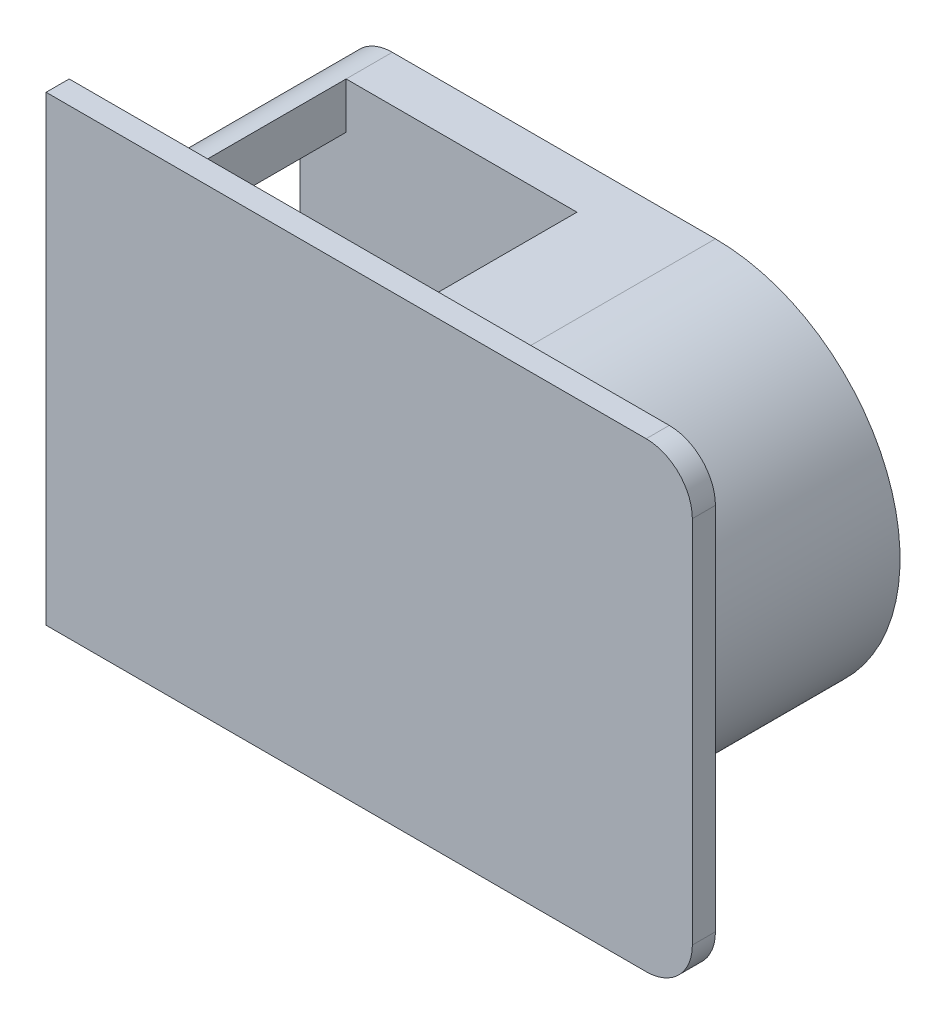
ISO-10303-21;
HEADER;
FILE_DESCRIPTION(('STEP AP214'),'2;1');
FILE_NAME('part.step','',(''),(''),'','','');
FILE_SCHEMA(('AUTOMOTIVE_DESIGN { 1 0 10303 214 1 1 1 1 }'));
ENDSEC;
DATA;
#1=APPLICATION_CONTEXT('core data for automotive mechanical design processes');
#2=APPLICATION_PROTOCOL_DEFINITION('international standard','automotive_design',2000,#1);
#3=PRODUCT_CONTEXT('',#1,'mechanical');
#4=PRODUCT('Part','Part','',(#3));
#5=PRODUCT_RELATED_PRODUCT_CATEGORY('part','',(#4));
#6=PRODUCT_DEFINITION_FORMATION('','',#4);
#7=PRODUCT_DEFINITION_CONTEXT('part definition',#1,'design');
#8=PRODUCT_DEFINITION('design','',#6,#7);
#9=PRODUCT_DEFINITION_SHAPE('','',#8);
#10=(LENGTH_UNIT() NAMED_UNIT(*) SI_UNIT(.MILLI.,.METRE.));
#11=(NAMED_UNIT(*) PLANE_ANGLE_UNIT() SI_UNIT($,.RADIAN.));
#12=(NAMED_UNIT(*) SI_UNIT($,.STERADIAN.) SOLID_ANGLE_UNIT());
#13=UNCERTAINTY_MEASURE_WITH_UNIT(LENGTH_MEASURE(1.E-05),#10,'distance_accuracy_value','');
#14=(GEOMETRIC_REPRESENTATION_CONTEXT(3) GLOBAL_UNCERTAINTY_ASSIGNED_CONTEXT((#13)) GLOBAL_UNIT_ASSIGNED_CONTEXT((#10,
#11,#12)) REPRESENTATION_CONTEXT('',''));
#15=CARTESIAN_POINT('',(0.,0.,0.));
#16=DIRECTION('',(0.,0.,1.));
#17=DIRECTION('',(1.,0.,0.));
#18=AXIS2_PLACEMENT_3D('',#15,#16,#17);
#19=CARTESIAN_POINT('',(-50.,-40.,50.));
#20=DIRECTION('',(-1.,0.,0.));
#21=DIRECTION('',(0.,0.,1.));
#22=AXIS2_PLACEMENT_3D('',#19,#20,#21);
#23=PLANE('',#22);
#24=DIRECTION('',(0.,1.,0.));
#25=VECTOR('',#24,1.);
#26=CARTESIAN_POINT('',(-50.,-40.,10.));
#27=LINE('',#26,#25);
#28=CARTESIAN_POINT('',(-50.,-40.,10.));
#29=VERTEX_POINT('',#28);
#30=CARTESIAN_POINT('',(-50.,-30.,10.));
#31=VERTEX_POINT('',#30);
#32=EDGE_CURVE('E254',#29,#31,#27,.T.);
#33=ORIENTED_EDGE('',*,*,#32,.T.);
#34=DIRECTION('',(0.,0.,1.));
#35=VECTOR('',#34,1.);
#36=CARTESIAN_POINT('',(-50.,-30.,50.));
#37=LINE('',#36,#35);
#38=CARTESIAN_POINT('',(-50.,-30.,50.));
#39=VERTEX_POINT('',#38);
#40=EDGE_CURVE('E218',#31,#39,#37,.T.);
#41=ORIENTED_EDGE('',*,*,#40,.T.);
#42=DIRECTION('',(0.,1.,0.));
#43=VECTOR('',#42,1.);
#44=CARTESIAN_POINT('',(-50.,-40.,50.));
#45=LINE('',#44,#43);
#46=CARTESIAN_POINT('',(-50.,-40.,50.));
#47=VERTEX_POINT('',#46);
#48=EDGE_CURVE('E250',#47,#39,#45,.T.);
#49=ORIENTED_EDGE('',*,*,#48,.F.);
#50=DIRECTION('',(0.,0.,1.));
#51=VECTOR('',#50,1.);
#52=CARTESIAN_POINT('',(-50.,-40.,50.));
#53=LINE('',#52,#51);
#54=EDGE_CURVE('E232',#29,#47,#53,.T.);
#55=ORIENTED_EDGE('',*,*,#54,.F.);
#56=EDGE_LOOP('',(#33,#41,#49,#55));
#57=FACE_BOUND('',#56,.T.);
#58=ADVANCED_FACE('F44',(#57),#23,.F.);
#59=CARTESIAN_POINT('',(0.,-40.,50.));
#60=DIRECTION('',(0.,1.,0.));
#61=DIRECTION('',(0.,0.,1.));
#62=AXIS2_PLACEMENT_3D('',#59,#60,#61);
#63=PLANE('',#62);
#64=DIRECTION('',(-1.,0.,0.));
#65=VECTOR('',#64,1.);
#66=CARTESIAN_POINT('',(-50.,-40.,10.));
#67=LINE('',#66,#65);
#68=CARTESIAN_POINT('',(0.,-40.,10.));
#69=VERTEX_POINT('',#68);
#70=EDGE_CURVE('E227',#69,#29,#67,.T.);
#71=ORIENTED_EDGE('',*,*,#70,.T.);
#72=DIRECTION('',(0.,0.,-1.));
#73=VECTOR('',#72,1.);
#74=CARTESIAN_POINT('',(-50.,-40.,0.));
#75=LINE('',#74,#73);
#76=CARTESIAN_POINT('',(-50.,-40.,0.));
#77=VERTEX_POINT('',#76);
#78=EDGE_CURVE('E361',#29,#77,#75,.T.);
#79=ORIENTED_EDGE('',*,*,#78,.T.);
#80=DIRECTION('',(1.,0.,0.));
#81=VECTOR('',#80,1.);
#82=CARTESIAN_POINT('',(0.,-40.,0.));
#83=LINE('',#82,#81);
#84=CARTESIAN_POINT('',(20.,-40.,0.));
#85=VERTEX_POINT('',#84);
#86=EDGE_CURVE('E304',#77,#85,#83,.T.);
#87=ORIENTED_EDGE('',*,*,#86,.T.);
#88=DIRECTION('',(0.,0.,-1.));
#89=VECTOR('',#88,1.);
#90=CARTESIAN_POINT('',(20.,-40.,50.));
#91=LINE('',#90,#89);
#92=CARTESIAN_POINT('',(20.,-40.,50.));
#93=VERTEX_POINT('',#92);
#94=EDGE_CURVE('E331',#93,#85,#91,.T.);
#95=ORIENTED_EDGE('',*,*,#94,.F.);
#96=DIRECTION('',(1.,0.,0.));
#97=VECTOR('',#96,1.);
#98=CARTESIAN_POINT('',(0.,-40.,50.));
#99=LINE('',#98,#97);
#100=CARTESIAN_POINT('',(0.,-40.,50.));
#101=VERTEX_POINT('',#100);
#102=EDGE_CURVE('E305',#101,#93,#99,.T.);
#103=ORIENTED_EDGE('',*,*,#102,.F.);
#104=DIRECTION('',(0.,0.,-1.));
#105=VECTOR('',#104,1.);
#106=CARTESIAN_POINT('',(0.,-40.,50.));
#107=LINE('',#106,#105);
#108=EDGE_CURVE('E223',#101,#69,#107,.T.);
#109=ORIENTED_EDGE('',*,*,#108,.T.);
#110=EDGE_LOOP('',(#71,#79,#87,#95,#103,#109));
#111=FACE_BOUND('',#110,.T.);
#112=ADVANCED_FACE('F419',(#111),#63,.F.);
#113=CARTESIAN_POINT('',(20.,0.,50.));
#114=DIRECTION('',(0.,0.,-1.));
#115=DIRECTION('',(-1.,0.,0.));
#116=AXIS2_PLACEMENT_3D('',#113,#114,#115);
#117=CYLINDRICAL_SURFACE('',#116,40.);
#118=CARTESIAN_POINT('',(20.,0.,0.));
#119=DIRECTION('',(0.,0.,1.));
#120=DIRECTION('',(1.,0.,0.));
#121=AXIS2_PLACEMENT_3D('',#118,#119,#120);
#122=CIRCLE('',#121,40.);
#123=CARTESIAN_POINT('',(20.,40.,0.));
#124=VERTEX_POINT('',#123);
#125=EDGE_CURVE('E319',#85,#124,#122,.T.);
#126=ORIENTED_EDGE('',*,*,#125,.T.);
#127=DIRECTION('',(0.,0.,-1.));
#128=VECTOR('',#127,1.);
#129=CARTESIAN_POINT('',(20.,40.,50.));
#130=LINE('',#129,#128);
#131=CARTESIAN_POINT('',(20.,40.,50.));
#132=VERTEX_POINT('',#131);
#133=EDGE_CURVE('E316',#132,#124,#130,.T.);
#134=ORIENTED_EDGE('',*,*,#133,.F.);
#135=CARTESIAN_POINT('',(20.,0.,50.));
#136=DIRECTION('',(0.,0.,1.));
#137=DIRECTION('',(1.,0.,0.));
#138=AXIS2_PLACEMENT_3D('',#135,#136,#137);
#139=CIRCLE('',#138,40.);
#140=EDGE_CURVE('E308',#93,#132,#139,.T.);
#141=ORIENTED_EDGE('',*,*,#140,.F.);
#142=ORIENTED_EDGE('',*,*,#94,.T.);
#143=EDGE_LOOP('',(#126,#134,#141,#142));
#144=FACE_BOUND('',#143,.T.);
#145=ADVANCED_FACE('F401',(#144),#117,.T.);
#146=CARTESIAN_POINT('',(0.,40.,50.));
#147=DIRECTION('',(0.,1.,0.));
#148=DIRECTION('',(0.,0.,1.));
#149=AXIS2_PLACEMENT_3D('',#146,#147,#148);
#150=PLANE('',#149);
#151=DIRECTION('',(1.,0.,0.));
#152=VECTOR('',#151,1.);
#153=CARTESIAN_POINT('',(0.,40.,0.));
#154=LINE('',#153,#152);
#155=CARTESIAN_POINT('',(-50.,40.,0.));
#156=VERTEX_POINT('',#155);
#157=EDGE_CURVE('E323',#156,#124,#154,.T.);
#158=ORIENTED_EDGE('',*,*,#157,.F.);
#159=DIRECTION('',(0.,0.,-1.));
#160=VECTOR('',#159,1.);
#161=CARTESIAN_POINT('',(-50.,40.,50.));
#162=LINE('',#161,#160);
#163=CARTESIAN_POINT('',(-50.,40.,10.));
#164=VERTEX_POINT('',#163);
#165=EDGE_CURVE('E53',#156,#164,#162,.F.);
#166=ORIENTED_EDGE('',*,*,#165,.T.);
#167=DIRECTION('',(-1.,0.,0.));
#168=VECTOR('',#167,1.);
#169=CARTESIAN_POINT('',(-50.,40.,10.));
#170=LINE('',#169,#168);
#171=CARTESIAN_POINT('',(0.,40.,10.));
#172=VERTEX_POINT('',#171);
#173=EDGE_CURVE('E240',#172,#164,#170,.T.);
#174=ORIENTED_EDGE('',*,*,#173,.F.);
#175=DIRECTION('',(0.,0.,-1.));
#176=VECTOR('',#175,1.);
#177=CARTESIAN_POINT('',(0.,40.,50.));
#178=LINE('',#177,#176);
#179=CARTESIAN_POINT('',(0.,40.,50.));
#180=VERTEX_POINT('',#179);
#181=EDGE_CURVE('E222',#180,#172,#178,.T.);
#182=ORIENTED_EDGE('',*,*,#181,.F.);
#183=DIRECTION('',(1.,0.,0.));
#184=VECTOR('',#183,1.);
#185=CARTESIAN_POINT('',(0.,40.,50.));
#186=LINE('',#185,#184);
#187=EDGE_CURVE('E313',#180,#132,#186,.T.);
#188=ORIENTED_EDGE('',*,*,#187,.T.);
#189=ORIENTED_EDGE('',*,*,#133,.T.);
#190=EDGE_LOOP('',(#158,#166,#174,#182,#188,#189));
#191=FACE_BOUND('',#190,.T.);
#192=ADVANCED_FACE('F381',(#191),#150,.T.);
#193=CARTESIAN_POINT('',(-60.,0.,50.));
#194=DIRECTION('',(-1.,0.,0.));
#195=DIRECTION('',(0.,0.,1.));
#196=AXIS2_PLACEMENT_3D('',#193,#194,#195);
#197=PLANE('',#196);
#198=DIRECTION('',(0.,-1.,0.));
#199=VECTOR('',#198,1.);
#200=CARTESIAN_POINT('',(-60.,-30.,10.));
#201=LINE('',#200,#199);
#202=CARTESIAN_POINT('',(-60.,30.,10.));
#203=VERTEX_POINT('',#202);
#204=CARTESIAN_POINT('',(-60.,-30.,10.));
#205=VERTEX_POINT('',#204);
#206=EDGE_CURVE('E192',#203,#205,#201,.T.);
#207=ORIENTED_EDGE('',*,*,#206,.F.);
#208=DIRECTION('',(0.,0.,-1.));
#209=VECTOR('',#208,1.);
#210=CARTESIAN_POINT('',(-60.,30.,50.));
#211=LINE('',#210,#209);
#212=CARTESIAN_POINT('',(-60.,30.,0.));
#213=VERTEX_POINT('',#212);
#214=EDGE_CURVE('E68',#203,#213,#211,.T.);
#215=ORIENTED_EDGE('',*,*,#214,.T.);
#216=DIRECTION('',(0.,1.,0.));
#217=VECTOR('',#216,1.);
#218=CARTESIAN_POINT('',(-60.,0.,0.));
#219=LINE('',#218,#217);
#220=CARTESIAN_POINT('',(-60.,-30.,0.));
#221=VERTEX_POINT('',#220);
#222=EDGE_CURVE('E309',#221,#213,#219,.T.);
#223=ORIENTED_EDGE('',*,*,#222,.F.);
#224=DIRECTION('',(0.,0.,-1.));
#225=VECTOR('',#224,1.);
#226=CARTESIAN_POINT('',(-60.,-30.,50.));
#227=LINE('',#226,#225);
#228=EDGE_CURVE('E367',#221,#205,#227,.F.);
#229=ORIENTED_EDGE('',*,*,#228,.T.);
#230=EDGE_LOOP('',(#207,#215,#223,#229));
#231=FACE_BOUND('',#230,.T.);
#232=ADVANCED_FACE('F412',(#231),#197,.T.);
#233=CARTESIAN_POINT('',(0.,0.,0.));
#234=DIRECTION('',(0.,0.,1.));
#235=DIRECTION('',(1.,0.,0.));
#236=AXIS2_PLACEMENT_3D('',#233,#234,#235);
#237=PLANE('',#236);
#238=CARTESIAN_POINT('',(-30.,0.,0.));
#239=DIRECTION('',(0.,0.,-1.));
#240=DIRECTION('',(-1.,0.,0.));
#241=AXIS2_PLACEMENT_3D('',#238,#239,#240);
#242=CIRCLE('',#241,2.5);
#243=CARTESIAN_POINT('',(-32.5,0.,0.));
#244=VERTEX_POINT('',#243);
#245=EDGE_CURVE('E200',#244,#244,#242,.T.);
#246=ORIENTED_EDGE('',*,*,#245,.F.);
#247=EDGE_LOOP('',(#246));
#248=FACE_BOUND('',#247,.T.);
#249=CARTESIAN_POINT('',(20.,0.,0.));
#250=DIRECTION('',(0.,0.,-1.));
#251=DIRECTION('',(-1.,0.,0.));
#252=AXIS2_PLACEMENT_3D('',#249,#250,#251);
#253=CIRCLE('',#252,5.);
#254=CARTESIAN_POINT('',(15.,0.,0.));
#255=VERTEX_POINT('',#254);
#256=EDGE_CURVE('E249',#255,#255,#253,.T.);
#257=ORIENTED_EDGE('',*,*,#256,.F.);
#258=EDGE_LOOP('',(#257));
#259=FACE_BOUND('',#258,.T.);
#260=ORIENTED_EDGE('',*,*,#222,.T.);
#261=CARTESIAN_POINT('',(-50.,30.,0.));
#262=DIRECTION('',(0.,0.,1.));
#263=DIRECTION('',(1.,0.,0.));
#264=AXIS2_PLACEMENT_3D('',#261,#262,#263);
#265=CIRCLE('',#264,10.);
#266=EDGE_CURVE('E60',#213,#156,#265,.F.);
#267=ORIENTED_EDGE('',*,*,#266,.T.);
#268=ORIENTED_EDGE('',*,*,#157,.T.);
#269=ORIENTED_EDGE('',*,*,#125,.F.);
#270=ORIENTED_EDGE('',*,*,#86,.F.);
#271=CARTESIAN_POINT('',(-50.,-30.,0.));
#272=DIRECTION('',(0.,0.,1.));
#273=DIRECTION('',(1.,0.,0.));
#274=AXIS2_PLACEMENT_3D('',#271,#272,#273);
#275=CIRCLE('',#274,10.);
#276=EDGE_CURVE('E364',#77,#221,#275,.F.);
#277=ORIENTED_EDGE('',*,*,#276,.T.);
#278=EDGE_LOOP('',(#260,#267,#268,#269,#270,#277));
#279=FACE_BOUND('',#278,.T.);
#280=ADVANCED_FACE('F404',(#248,#259,#279),#237,.F.);
#281=CARTESIAN_POINT('',(70.,-50.,55.));
#282=DIRECTION('',(-1.,0.,0.));
#283=DIRECTION('',(0.,0.,1.));
#284=AXIS2_PLACEMENT_3D('',#281,#282,#283);
#285=PLANE('',#284);
#286=DIRECTION('',(0.,1.,0.));
#287=VECTOR('',#286,1.);
#288=CARTESIAN_POINT('',(70.,-50.,50.));
#289=LINE('',#288,#287);
#290=CARTESIAN_POINT('',(70.,-40.,50.));
#291=VERTEX_POINT('',#290);
#292=CARTESIAN_POINT('',(70.,40.,50.));
#293=VERTEX_POINT('',#292);
#294=EDGE_CURVE('E265',#291,#293,#289,.T.);
#295=ORIENTED_EDGE('',*,*,#294,.T.);
#296=DIRECTION('',(0.,0.,-1.));
#297=VECTOR('',#296,1.);
#298=CARTESIAN_POINT('',(70.,40.,55.));
#299=LINE('',#298,#297);
#300=CARTESIAN_POINT('',(70.,40.,55.));
#301=VERTEX_POINT('',#300);
#302=EDGE_CURVE('E355',#293,#301,#299,.F.);
#303=ORIENTED_EDGE('',*,*,#302,.T.);
#304=DIRECTION('',(0.,1.,0.));
#305=VECTOR('',#304,1.);
#306=CARTESIAN_POINT('',(70.,-50.,55.));
#307=LINE('',#306,#305);
#308=CARTESIAN_POINT('',(70.,-40.,55.));
#309=VERTEX_POINT('',#308);
#310=EDGE_CURVE('E269',#309,#301,#307,.T.);
#311=ORIENTED_EDGE('',*,*,#310,.F.);
#312=DIRECTION('',(0.,0.,-1.));
#313=VECTOR('',#312,1.);
#314=CARTESIAN_POINT('',(70.,-40.,55.));
#315=LINE('',#314,#313);
#316=EDGE_CURVE('E334',#309,#291,#315,.T.);
#317=ORIENTED_EDGE('',*,*,#316,.T.);
#318=EDGE_LOOP('',(#295,#303,#311,#317));
#319=FACE_BOUND('',#318,.T.);
#320=ADVANCED_FACE('F503',(#319),#285,.F.);
#321=CARTESIAN_POINT('',(-70.,50.,55.));
#322=DIRECTION('',(0.,-1.,0.));
#323=DIRECTION('',(0.,0.,-1.));
#324=AXIS2_PLACEMENT_3D('',#321,#322,#323);
#325=PLANE('',#324);
#326=DIRECTION('',(-1.,0.,0.));
#327=VECTOR('',#326,1.);
#328=CARTESIAN_POINT('',(-70.,50.,55.));
#329=LINE('',#328,#327);
#330=CARTESIAN_POINT('',(60.,50.,55.));
#331=VERTEX_POINT('',#330);
#332=CARTESIAN_POINT('',(-70.,50.,55.));
#333=VERTEX_POINT('',#332);
#334=EDGE_CURVE('E273',#331,#333,#329,.T.);
#335=ORIENTED_EDGE('',*,*,#334,.F.);
#336=DIRECTION('',(0.,0.,-1.));
#337=VECTOR('',#336,1.);
#338=CARTESIAN_POINT('',(60.,50.,55.));
#339=LINE('',#338,#337);
#340=CARTESIAN_POINT('',(60.,50.,50.));
#341=VERTEX_POINT('',#340);
#342=EDGE_CURVE('E348',#331,#341,#339,.T.);
#343=ORIENTED_EDGE('',*,*,#342,.T.);
#344=DIRECTION('',(-1.,0.,0.));
#345=VECTOR('',#344,1.);
#346=CARTESIAN_POINT('',(-70.,50.,50.));
#347=LINE('',#346,#345);
#348=CARTESIAN_POINT('',(-70.,50.,50.));
#349=VERTEX_POINT('',#348);
#350=EDGE_CURVE('E288',#341,#349,#347,.T.);
#351=ORIENTED_EDGE('',*,*,#350,.T.);
#352=DIRECTION('',(0.,0.,-1.));
#353=VECTOR('',#352,1.);
#354=CARTESIAN_POINT('',(-70.,50.,55.));
#355=LINE('',#354,#353);
#356=EDGE_CURVE('E300',#333,#349,#355,.T.);
#357=ORIENTED_EDGE('',*,*,#356,.F.);
#358=EDGE_LOOP('',(#335,#343,#351,#357));
#359=FACE_BOUND('',#358,.T.);
#360=ADVANCED_FACE('F574',(#359),#325,.F.);
#361=CARTESIAN_POINT('',(-70.,-50.,55.));
#362=DIRECTION('',(1.,0.,0.));
#363=DIRECTION('',(0.,0.,-1.));
#364=AXIS2_PLACEMENT_3D('',#361,#362,#363);
#365=PLANE('',#364);
#366=DIRECTION('',(0.,-1.,0.));
#367=VECTOR('',#366,1.);
#368=CARTESIAN_POINT('',(-70.,-50.,50.));
#369=LINE('',#368,#367);
#370=CARTESIAN_POINT('',(-70.,-50.,50.));
#371=VERTEX_POINT('',#370);
#372=EDGE_CURVE('E291',#349,#371,#369,.T.);
#373=ORIENTED_EDGE('',*,*,#372,.T.);
#374=DIRECTION('',(0.,0.,-1.));
#375=VECTOR('',#374,1.);
#376=CARTESIAN_POINT('',(-70.,-50.,55.));
#377=LINE('',#376,#375);
#378=CARTESIAN_POINT('',(-70.,-50.,55.));
#379=VERTEX_POINT('',#378);
#380=EDGE_CURVE('E284',#379,#371,#377,.T.);
#381=ORIENTED_EDGE('',*,*,#380,.F.);
#382=DIRECTION('',(0.,-1.,0.));
#383=VECTOR('',#382,1.);
#384=CARTESIAN_POINT('',(-70.,-50.,55.));
#385=LINE('',#384,#383);
#386=EDGE_CURVE('E277',#333,#379,#385,.T.);
#387=ORIENTED_EDGE('',*,*,#386,.F.);
#388=ORIENTED_EDGE('',*,*,#356,.T.);
#389=EDGE_LOOP('',(#373,#381,#387,#388));
#390=FACE_BOUND('',#389,.T.);
#391=ADVANCED_FACE('F579',(#390),#365,.F.);
#392=CARTESIAN_POINT('',(-70.,-50.,55.));
#393=DIRECTION('',(0.,1.,0.));
#394=DIRECTION('',(0.,0.,1.));
#395=AXIS2_PLACEMENT_3D('',#392,#393,#394);
#396=PLANE('',#395);
#397=DIRECTION('',(1.,0.,0.));
#398=VECTOR('',#397,1.);
#399=CARTESIAN_POINT('',(-70.,-50.,50.));
#400=LINE('',#399,#398);
#401=CARTESIAN_POINT('',(60.,-50.,50.));
#402=VERTEX_POINT('',#401);
#403=EDGE_CURVE('E274',#371,#402,#400,.T.);
#404=ORIENTED_EDGE('',*,*,#403,.T.);
#405=DIRECTION('',(0.,0.,-1.));
#406=VECTOR('',#405,1.);
#407=CARTESIAN_POINT('',(60.,-50.,55.));
#408=LINE('',#407,#406);
#409=CARTESIAN_POINT('',(60.,-50.,55.));
#410=VERTEX_POINT('',#409);
#411=EDGE_CURVE('E342',#402,#410,#408,.F.);
#412=ORIENTED_EDGE('',*,*,#411,.T.);
#413=DIRECTION('',(1.,0.,0.));
#414=VECTOR('',#413,1.);
#415=CARTESIAN_POINT('',(-70.,-50.,55.));
#416=LINE('',#415,#414);
#417=EDGE_CURVE('E280',#379,#410,#416,.T.);
#418=ORIENTED_EDGE('',*,*,#417,.F.);
#419=ORIENTED_EDGE('',*,*,#380,.T.);
#420=EDGE_LOOP('',(#404,#412,#418,#419));
#421=FACE_BOUND('',#420,.T.);
#422=ADVANCED_FACE('F564',(#421),#396,.F.);
#423=CARTESIAN_POINT('',(0.,0.,55.));
#424=DIRECTION('',(0.,0.,-1.));
#425=DIRECTION('',(-1.,0.,0.));
#426=AXIS2_PLACEMENT_3D('',#423,#424,#425);
#427=PLANE('',#426);
#428=ORIENTED_EDGE('',*,*,#310,.T.);
#429=CARTESIAN_POINT('',(60.,40.,55.));
#430=DIRECTION('',(0.,0.,-1.));
#431=DIRECTION('',(-1.,0.,0.));
#432=AXIS2_PLACEMENT_3D('',#429,#430,#431);
#433=CIRCLE('',#432,10.);
#434=EDGE_CURVE('E358',#301,#331,#433,.F.);
#435=ORIENTED_EDGE('',*,*,#434,.T.);
#436=ORIENTED_EDGE('',*,*,#334,.T.);
#437=ORIENTED_EDGE('',*,*,#386,.T.);
#438=ORIENTED_EDGE('',*,*,#417,.T.);
#439=CARTESIAN_POINT('',(60.,-40.,55.));
#440=DIRECTION('',(0.,0.,-1.));
#441=DIRECTION('',(-1.,0.,0.));
#442=AXIS2_PLACEMENT_3D('',#439,#440,#441);
#443=CIRCLE('',#442,10.);
#444=EDGE_CURVE('E345',#410,#309,#443,.F.);
#445=ORIENTED_EDGE('',*,*,#444,.T.);
#446=EDGE_LOOP('',(#428,#435,#436,#437,#438,#445));
#447=FACE_BOUND('',#446,.T.);
#448=ADVANCED_FACE('F489',(#447),#427,.F.);
#449=CARTESIAN_POINT('',(0.,0.,50.));
#450=DIRECTION('',(0.,0.,-1.));
#451=DIRECTION('',(-1.,0.,0.));
#452=AXIS2_PLACEMENT_3D('',#449,#450,#451);
#453=PLANE('',#452);
#454=ORIENTED_EDGE('',*,*,#48,.T.);
#455=DIRECTION('',(-1.,0.,0.));
#456=VECTOR('',#455,1.);
#457=CARTESIAN_POINT('',(-10.,-30.,50.));
#458=LINE('',#457,#456);
#459=CARTESIAN_POINT('',(-60.,-30.,50.));
#460=VERTEX_POINT('',#459);
#461=EDGE_CURVE('E206',#39,#460,#458,.T.);
#462=ORIENTED_EDGE('',*,*,#461,.T.);
#463=CARTESIAN_POINT('',(-50.,-30.,50.));
#464=DIRECTION('',(0.,0.,-1.));
#465=DIRECTION('',(-1.,0.,0.));
#466=AXIS2_PLACEMENT_3D('',#463,#464,#465);
#467=CIRCLE('',#466,10.);
#468=EDGE_CURVE('E370',#460,#47,#467,.F.);
#469=ORIENTED_EDGE('',*,*,#468,.T.);
#470=EDGE_LOOP('',(#454,#462,#469));
#471=FACE_BOUND('',#470,.T.);
#472=DIRECTION('',(-1.,0.,0.));
#473=VECTOR('',#472,1.);
#474=CARTESIAN_POINT('',(-10.,30.,50.));
#475=LINE('',#474,#473);
#476=CARTESIAN_POINT('',(-50.,30.,50.));
#477=VERTEX_POINT('',#476);
#478=CARTESIAN_POINT('',(-60.,30.,50.));
#479=VERTEX_POINT('',#478);
#480=EDGE_CURVE('E173',#477,#479,#475,.T.);
#481=ORIENTED_EDGE('',*,*,#480,.F.);
#482=CARTESIAN_POINT('',(-50.,40.,50.));
#483=VERTEX_POINT('',#482);
#484=EDGE_CURVE('E175',#477,#483,#45,.T.);
#485=ORIENTED_EDGE('',*,*,#484,.T.);
#486=CARTESIAN_POINT('',(-50.,30.,50.));
#487=DIRECTION('',(0.,0.,-1.));
#488=DIRECTION('',(-1.,0.,0.));
#489=AXIS2_PLACEMENT_3D('',#486,#487,#488);
#490=CIRCLE('',#489,10.);
#491=EDGE_CURVE('E11',#483,#479,#490,.F.);
#492=ORIENTED_EDGE('',*,*,#491,.T.);
#493=EDGE_LOOP('',(#481,#485,#492));
#494=FACE_BOUND('',#493,.T.);
#495=DIRECTION('',(0.,1.,0.));
#496=VECTOR('',#495,1.);
#497=CARTESIAN_POINT('',(0.,-40.,50.));
#498=LINE('',#497,#496);
#499=EDGE_CURVE('E246',#101,#180,#498,.T.);
#500=ORIENTED_EDGE('',*,*,#499,.F.);
#501=ORIENTED_EDGE('',*,*,#102,.T.);
#502=ORIENTED_EDGE('',*,*,#140,.T.);
#503=ORIENTED_EDGE('',*,*,#187,.F.);
#504=EDGE_LOOP('',(#500,#501,#502,#503));
#505=FACE_BOUND('',#504,.T.);
#506=ORIENTED_EDGE('',*,*,#350,.F.);
#507=CARTESIAN_POINT('',(60.,40.,50.));
#508=DIRECTION('',(0.,0.,-1.));
#509=DIRECTION('',(-1.,0.,0.));
#510=AXIS2_PLACEMENT_3D('',#507,#508,#509);
#511=CIRCLE('',#510,10.);
#512=EDGE_CURVE('E352',#341,#293,#511,.T.);
#513=ORIENTED_EDGE('',*,*,#512,.T.);
#514=ORIENTED_EDGE('',*,*,#294,.F.);
#515=CARTESIAN_POINT('',(60.,-40.,50.));
#516=DIRECTION('',(0.,0.,-1.));
#517=DIRECTION('',(-1.,0.,0.));
#518=AXIS2_PLACEMENT_3D('',#515,#516,#517);
#519=CIRCLE('',#518,10.);
#520=EDGE_CURVE('E339',#291,#402,#519,.T.);
#521=ORIENTED_EDGE('',*,*,#520,.T.);
#522=ORIENTED_EDGE('',*,*,#403,.F.);
#523=ORIENTED_EDGE('',*,*,#372,.F.);
#524=EDGE_LOOP('',(#506,#513,#514,#521,#522,#523));
#525=FACE_BOUND('',#524,.T.);
#526=ADVANCED_FACE('F171',(#471,#494,#505,#525),#453,.T.);
#527=CARTESIAN_POINT('',(20.,0.,5.));
#528=DIRECTION('',(0.,0.,-1.));
#529=DIRECTION('',(-1.,0.,0.));
#530=AXIS2_PLACEMENT_3D('',#527,#528,#529);
#531=CYLINDRICAL_SURFACE('',#530,5.);
#532=CARTESIAN_POINT('',(20.,0.,5.));
#533=DIRECTION('',(0.,0.,-1.));
#534=DIRECTION('',(-1.,0.,0.));
#535=AXIS2_PLACEMENT_3D('',#532,#533,#534);
#536=CIRCLE('',#535,5.);
#537=CARTESIAN_POINT('',(15.,0.,5.));
#538=VERTEX_POINT('',#537);
#539=EDGE_CURVE('E261',#538,#538,#536,.T.);
#540=ORIENTED_EDGE('',*,*,#539,.F.);
#541=EDGE_LOOP('',(#540));
#542=FACE_BOUND('',#541,.T.);
#543=ORIENTED_EDGE('',*,*,#256,.T.);
#544=EDGE_LOOP('',(#543));
#545=FACE_BOUND('',#544,.T.);
#546=ADVANCED_FACE('F488',(#542,#545),#531,.F.);
#547=CARTESIAN_POINT('',(20.,0.,5.));
#548=DIRECTION('',(0.,0.,-1.));
#549=DIRECTION('',(-1.,0.,0.));
#550=AXIS2_PLACEMENT_3D('',#547,#548,#549);
#551=PLANE('',#550);
#552=ORIENTED_EDGE('',*,*,#539,.T.);
#553=EDGE_LOOP('',(#552));
#554=FACE_BOUND('',#553,.T.);
#555=ADVANCED_FACE('F620',(#554),#551,.T.);
#556=CARTESIAN_POINT('',(0.,-40.,50.));
#557=DIRECTION('',(1.,0.,0.));
#558=DIRECTION('',(0.,0.,-1.));
#559=AXIS2_PLACEMENT_3D('',#556,#557,#558);
#560=PLANE('',#559);
#561=ORIENTED_EDGE('',*,*,#181,.T.);
#562=DIRECTION('',(0.,1.,0.));
#563=VECTOR('',#562,1.);
#564=CARTESIAN_POINT('',(0.,-40.,10.));
#565=LINE('',#564,#563);
#566=EDGE_CURVE('E236',#69,#172,#565,.T.);
#567=ORIENTED_EDGE('',*,*,#566,.F.);
#568=ORIENTED_EDGE('',*,*,#108,.F.);
#569=ORIENTED_EDGE('',*,*,#499,.T.);
#570=EDGE_LOOP('',(#561,#567,#568,#569));
#571=FACE_BOUND('',#570,.T.);
#572=ADVANCED_FACE('F392',(#571),#560,.F.);
#573=ORIENTED_EDGE('',*,*,#484,.F.);
#574=DIRECTION('',(0.,0.,-1.));
#575=VECTOR('',#574,1.);
#576=CARTESIAN_POINT('',(-50.,30.,50.));
#577=LINE('',#576,#575);
#578=CARTESIAN_POINT('',(-50.,30.,10.));
#579=VERTEX_POINT('',#578);
#580=EDGE_CURVE('E185',#477,#579,#577,.T.);
#581=ORIENTED_EDGE('',*,*,#580,.T.);
#582=EDGE_CURVE('E258',#579,#164,#27,.T.);
#583=ORIENTED_EDGE('',*,*,#582,.T.);
#584=DIRECTION('',(0.,0.,1.));
#585=VECTOR('',#584,1.);
#586=CARTESIAN_POINT('',(-50.,40.,50.));
#587=LINE('',#586,#585);
#588=EDGE_CURVE('E228',#164,#483,#587,.T.);
#589=ORIENTED_EDGE('',*,*,#588,.T.);
#590=EDGE_LOOP('',(#573,#581,#583,#589));
#591=FACE_BOUND('',#590,.T.);
#592=ADVANCED_FACE('F385',(#591),#23,.F.);
#593=CARTESIAN_POINT('',(-50.,-40.,10.));
#594=DIRECTION('',(0.,0.,-1.));
#595=DIRECTION('',(-1.,0.,0.));
#596=AXIS2_PLACEMENT_3D('',#593,#594,#595);
#597=PLANE('',#596);
#598=CARTESIAN_POINT('',(-30.,0.,10.));
#599=DIRECTION('',(0.,0.,-1.));
#600=DIRECTION('',(-1.,0.,0.));
#601=AXIS2_PLACEMENT_3D('',#598,#599,#600);
#602=CIRCLE('',#601,2.5);
#603=CARTESIAN_POINT('',(-32.5,0.,10.));
#604=VERTEX_POINT('',#603);
#605=EDGE_CURVE('E193',#604,#604,#602,.T.);
#606=ORIENTED_EDGE('',*,*,#605,.T.);
#607=EDGE_LOOP('',(#606));
#608=FACE_BOUND('',#607,.T.);
#609=ORIENTED_EDGE('',*,*,#582,.F.);
#610=DIRECTION('',(-1.,0.,0.));
#611=VECTOR('',#610,1.);
#612=CARTESIAN_POINT('',(-10.,30.,10.));
#613=LINE('',#612,#611);
#614=EDGE_CURVE('E187',#579,#203,#613,.T.);
#615=ORIENTED_EDGE('',*,*,#614,.T.);
#616=ORIENTED_EDGE('',*,*,#206,.T.);
#617=DIRECTION('',(-1.,0.,0.));
#618=VECTOR('',#617,1.);
#619=CARTESIAN_POINT('',(-10.,-30.,10.));
#620=LINE('',#619,#618);
#621=EDGE_CURVE('E210',#31,#205,#620,.T.);
#622=ORIENTED_EDGE('',*,*,#621,.F.);
#623=ORIENTED_EDGE('',*,*,#32,.F.);
#624=ORIENTED_EDGE('',*,*,#70,.F.);
#625=ORIENTED_EDGE('',*,*,#566,.T.);
#626=ORIENTED_EDGE('',*,*,#173,.T.);
#627=EDGE_LOOP('',(#609,#615,#616,#622,#623,#624,#625,#626));
#628=FACE_BOUND('',#627,.T.);
#629=ADVANCED_FACE('F388',(#608,#628),#597,.F.);
#630=CARTESIAN_POINT('',(-10.,-30.,10.));
#631=DIRECTION('',(0.,-1.,0.));
#632=DIRECTION('',(0.,0.,-1.));
#633=AXIS2_PLACEMENT_3D('',#630,#631,#632);
#634=PLANE('',#633);
#635=ORIENTED_EDGE('',*,*,#621,.T.);
#636=DIRECTION('',(0.,0.,1.));
#637=VECTOR('',#636,1.);
#638=CARTESIAN_POINT('',(-60.,-30.,10.));
#639=LINE('',#638,#637);
#640=EDGE_CURVE('E188',#205,#460,#639,.T.);
#641=ORIENTED_EDGE('',*,*,#640,.T.);
#642=ORIENTED_EDGE('',*,*,#461,.F.);
#643=ORIENTED_EDGE('',*,*,#40,.F.);
#644=EDGE_LOOP('',(#635,#641,#642,#643));
#645=FACE_BOUND('',#644,.T.);
#646=ADVANCED_FACE('F415',(#645),#634,.F.);
#647=CARTESIAN_POINT('',(-10.,30.,10.));
#648=DIRECTION('',(0.,1.,0.));
#649=DIRECTION('',(0.,0.,1.));
#650=AXIS2_PLACEMENT_3D('',#647,#648,#649);
#651=PLANE('',#650);
#652=ORIENTED_EDGE('',*,*,#480,.T.);
#653=DIRECTION('',(0.,0.,-1.));
#654=VECTOR('',#653,1.);
#655=CARTESIAN_POINT('',(-60.,30.,10.));
#656=LINE('',#655,#654);
#657=EDGE_CURVE('E183',#479,#203,#656,.T.);
#658=ORIENTED_EDGE('',*,*,#657,.T.);
#659=ORIENTED_EDGE('',*,*,#614,.F.);
#660=ORIENTED_EDGE('',*,*,#580,.F.);
#661=EDGE_LOOP('',(#652,#658,#659,#660));
#662=FACE_BOUND('',#661,.T.);
#663=ADVANCED_FACE('F182',(#662),#651,.F.);
#664=CARTESIAN_POINT('',(-30.,0.,20.));
#665=DIRECTION('',(0.,0.,-1.));
#666=DIRECTION('',(-1.,0.,0.));
#667=AXIS2_PLACEMENT_3D('',#664,#665,#666);
#668=CYLINDRICAL_SURFACE('',#667,2.5);
#669=ORIENTED_EDGE('',*,*,#245,.T.);
#670=EDGE_LOOP('',(#669));
#671=FACE_BOUND('',#670,.T.);
#672=ORIENTED_EDGE('',*,*,#605,.F.);
#673=EDGE_LOOP('',(#672));
#674=FACE_BOUND('',#673,.T.);
#675=ADVANCED_FACE('F434',(#671,#674),#668,.F.);
#676=CARTESIAN_POINT('',(60.,-40.,55.));
#677=DIRECTION('',(0.,0.,-1.));
#678=DIRECTION('',(-1.,0.,0.));
#679=AXIS2_PLACEMENT_3D('',#676,#677,#678);
#680=CYLINDRICAL_SURFACE('',#679,10.);
#681=ORIENTED_EDGE('',*,*,#444,.F.);
#682=ORIENTED_EDGE('',*,*,#411,.F.);
#683=ORIENTED_EDGE('',*,*,#520,.F.);
#684=ORIENTED_EDGE('',*,*,#316,.F.);
#685=EDGE_LOOP('',(#681,#682,#683,#684));
#686=FACE_BOUND('',#685,.T.);
#687=ADVANCED_FACE('F430',(#686),#680,.T.);
#688=CARTESIAN_POINT('',(60.,40.,55.));
#689=DIRECTION('',(0.,0.,-1.));
#690=DIRECTION('',(-1.,0.,0.));
#691=AXIS2_PLACEMENT_3D('',#688,#689,#690);
#692=CYLINDRICAL_SURFACE('',#691,10.);
#693=ORIENTED_EDGE('',*,*,#434,.F.);
#694=ORIENTED_EDGE('',*,*,#302,.F.);
#695=ORIENTED_EDGE('',*,*,#512,.F.);
#696=ORIENTED_EDGE('',*,*,#342,.F.);
#697=EDGE_LOOP('',(#693,#694,#695,#696));
#698=FACE_BOUND('',#697,.T.);
#699=ADVANCED_FACE('F433',(#698),#692,.T.);
#700=CARTESIAN_POINT('',(-50.,-30.,50.));
#701=DIRECTION('',(0.,0.,1.));
#702=DIRECTION('',(1.,0.,0.));
#703=AXIS2_PLACEMENT_3D('',#700,#701,#702);
#704=CYLINDRICAL_SURFACE('',#703,10.);
#705=ORIENTED_EDGE('',*,*,#640,.F.);
#706=ORIENTED_EDGE('',*,*,#228,.F.);
#707=ORIENTED_EDGE('',*,*,#276,.F.);
#708=ORIENTED_EDGE('',*,*,#78,.F.);
#709=ORIENTED_EDGE('',*,*,#54,.T.);
#710=ORIENTED_EDGE('',*,*,#468,.F.);
#711=EDGE_LOOP('',(#705,#706,#707,#708,#709,#710));
#712=FACE_BOUND('',#711,.T.);
#713=ADVANCED_FACE('F410',(#712),#704,.T.);
#714=CARTESIAN_POINT('',(-50.,30.,50.));
#715=DIRECTION('',(0.,0.,-1.));
#716=DIRECTION('',(-1.,0.,0.));
#717=AXIS2_PLACEMENT_3D('',#714,#715,#716);
#718=CYLINDRICAL_SURFACE('',#717,10.);
#719=ORIENTED_EDGE('',*,*,#588,.F.);
#720=ORIENTED_EDGE('',*,*,#165,.F.);
#721=ORIENTED_EDGE('',*,*,#266,.F.);
#722=ORIENTED_EDGE('',*,*,#214,.F.);
#723=ORIENTED_EDGE('',*,*,#657,.F.);
#724=ORIENTED_EDGE('',*,*,#491,.F.);
#725=EDGE_LOOP('',(#719,#720,#721,#722,#723,#724));
#726=FACE_BOUND('',#725,.T.);
#727=ADVANCED_FACE('F46',(#726),#718,.T.);
#728=CLOSED_SHELL('',(#58,#112,#145,#192,#232,#280,#320,#360,#391,#422,#448,#526,#546,#555,#572,
#592,#629,#646,#663,#675,#687,#699,#713,#727));
#729=MANIFOLD_SOLID_BREP('B2',#728);
#730=ADVANCED_BREP_SHAPE_REPRESENTATION('',(#18,#729),#14);
#731=SHAPE_DEFINITION_REPRESENTATION(#9,#730);
ENDSEC;
END-ISO-10303-21;
